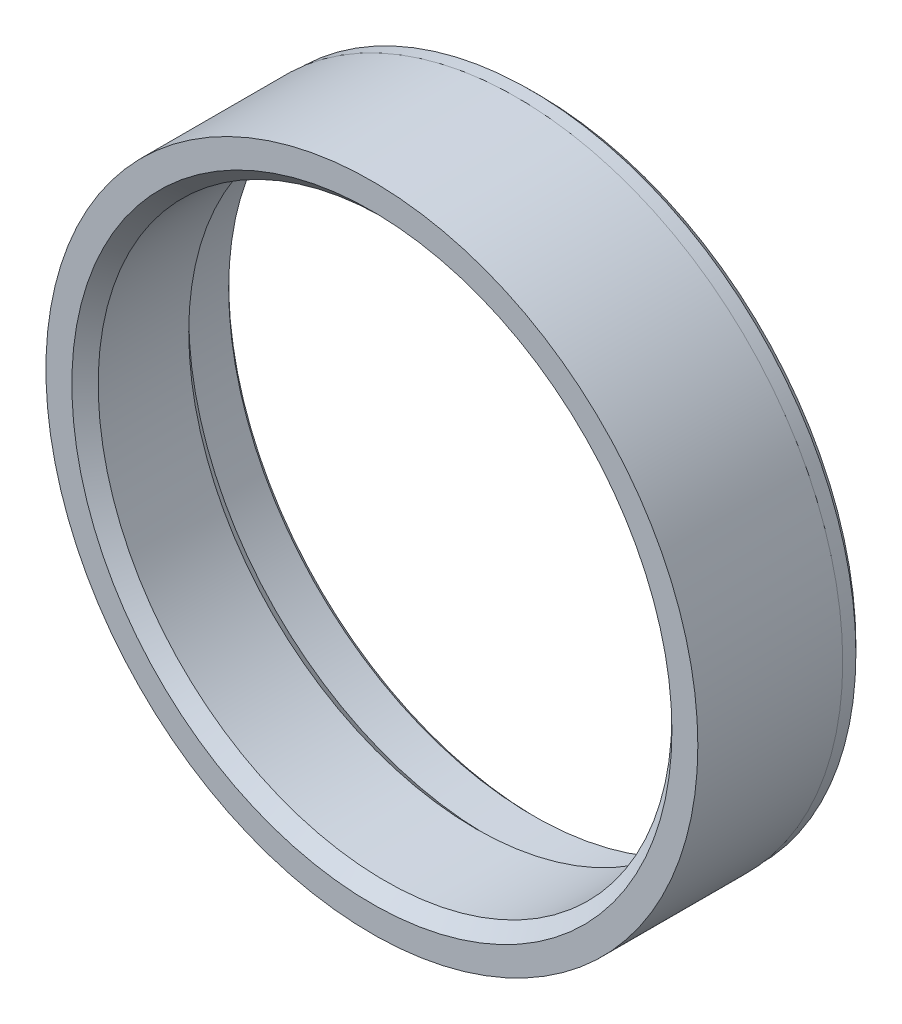
ISO-10303-21;
HEADER;
FILE_DESCRIPTION(('STEP AP214'),'2;1');
FILE_NAME('part.step','',(''),(''),'','','');
FILE_SCHEMA(('AUTOMOTIVE_DESIGN { 1 0 10303 214 1 1 1 1 }'));
ENDSEC;
DATA;
#1=APPLICATION_CONTEXT('core data for automotive mechanical design processes');
#2=APPLICATION_PROTOCOL_DEFINITION('international standard','automotive_design',2000,#1);
#3=PRODUCT_CONTEXT('',#1,'mechanical');
#4=PRODUCT('Part','Part','',(#3));
#5=PRODUCT_RELATED_PRODUCT_CATEGORY('part','',(#4));
#6=PRODUCT_DEFINITION_FORMATION('','',#4);
#7=PRODUCT_DEFINITION_CONTEXT('part definition',#1,'design');
#8=PRODUCT_DEFINITION('design','',#6,#7);
#9=PRODUCT_DEFINITION_SHAPE('','',#8);
#10=(LENGTH_UNIT() NAMED_UNIT(*) SI_UNIT(.MILLI.,.METRE.));
#11=(NAMED_UNIT(*) PLANE_ANGLE_UNIT() SI_UNIT($,.RADIAN.));
#12=(NAMED_UNIT(*) SI_UNIT($,.STERADIAN.) SOLID_ANGLE_UNIT());
#13=UNCERTAINTY_MEASURE_WITH_UNIT(LENGTH_MEASURE(1.E-05),#10,'distance_accuracy_value','');
#14=(GEOMETRIC_REPRESENTATION_CONTEXT(3) GLOBAL_UNCERTAINTY_ASSIGNED_CONTEXT((#13)) GLOBAL_UNIT_ASSIGNED_CONTEXT((#10,
#11,#12)) REPRESENTATION_CONTEXT('',''));
#15=CARTESIAN_POINT('',(0.,0.,0.));
#16=DIRECTION('',(0.,0.,1.));
#17=DIRECTION('',(1.,0.,0.));
#18=AXIS2_PLACEMENT_3D('',#15,#16,#17);
#19=CARTESIAN_POINT('',(0.,0.,-10.1));
#20=DIRECTION('',(0.,0.,1.));
#21=DIRECTION('',(1.,0.,0.));
#22=AXIS2_PLACEMENT_3D('',#19,#20,#21);
#23=CYLINDRICAL_SURFACE('',#22,19.8);
#24=CARTESIAN_POINT('',(0.,0.,0.));
#25=DIRECTION('',(0.,0.,1.));
#26=DIRECTION('',(1.,0.,0.));
#27=AXIS2_PLACEMENT_3D('',#24,#25,#26);
#28=CIRCLE('',#27,19.8);
#29=CARTESIAN_POINT('',(19.8,0.,0.));
#30=VERTEX_POINT('',#29);
#31=EDGE_CURVE('E66',#30,#30,#28,.T.);
#32=ORIENTED_EDGE('',*,*,#31,.F.);
#33=EDGE_LOOP('',(#32));
#34=FACE_BOUND('',#33,.T.);
#35=CARTESIAN_POINT('',(0.,0.,-8.8));
#36=DIRECTION('',(0.,0.,-1.));
#37=DIRECTION('',(-1.,0.,0.));
#38=AXIS2_PLACEMENT_3D('',#35,#36,#37);
#39=CIRCLE('',#38,19.8);
#40=CARTESIAN_POINT('',(-19.8,0.,-8.8));
#41=VERTEX_POINT('',#40);
#42=EDGE_CURVE('E50',#41,#41,#39,.F.);
#43=ORIENTED_EDGE('',*,*,#42,.T.);
#44=EDGE_LOOP('',(#43));
#45=FACE_BOUND('',#44,.T.);
#46=ADVANCED_FACE('F15',(#34,#45),#23,.T.);
#47=CARTESIAN_POINT('',(0.,0.,-9.6));
#48=DIRECTION('',(0.,0.,1.));
#49=DIRECTION('',(1.,0.,0.));
#50=AXIS2_PLACEMENT_3D('',#47,#48,#49);
#51=CONICAL_SURFACE('',#50,19.8,0.785398163397448);
#52=CARTESIAN_POINT('',(0.,0.,-10.1));
#53=DIRECTION('',(0.,0.,1.));
#54=DIRECTION('',(1.,0.,0.));
#55=AXIS2_PLACEMENT_3D('',#52,#53,#54);
#56=CIRCLE('',#55,19.3);
#57=CARTESIAN_POINT('',(19.3,0.,-10.1));
#58=VERTEX_POINT('',#57);
#59=EDGE_CURVE('E46',#58,#58,#56,.F.);
#60=ORIENTED_EDGE('',*,*,#59,.F.);
#61=EDGE_LOOP('',(#60));
#62=FACE_BOUND('',#61,.T.);
#63=CARTESIAN_POINT('',(0.,0.,-9.65));
#64=DIRECTION('',(0.,0.,1.));
#65=DIRECTION('',(1.,0.,0.));
#66=AXIS2_PLACEMENT_3D('',#63,#64,#65);
#67=CIRCLE('',#66,19.75);
#68=CARTESIAN_POINT('',(19.75,0.,-9.65));
#69=VERTEX_POINT('',#68);
#70=EDGE_CURVE('E55',#69,#69,#67,.F.);
#71=ORIENTED_EDGE('',*,*,#70,.T.);
#72=EDGE_LOOP('',(#71));
#73=FACE_BOUND('',#72,.T.);
#74=ADVANCED_FACE('F99',(#62,#73),#51,.T.);
#75=CARTESIAN_POINT('',(0.,0.,-10.1));
#76=DIRECTION('',(0.,0.,1.));
#77=DIRECTION('',(1.,0.,0.));
#78=AXIS2_PLACEMENT_3D('',#75,#76,#77);
#79=CYLINDRICAL_SURFACE('',#78,17.425);
#80=CARTESIAN_POINT('',(0.,0.,-0.8));
#81=DIRECTION('',(0.,0.,1.));
#82=DIRECTION('',(1.,0.,0.));
#83=AXIS2_PLACEMENT_3D('',#80,#81,#82);
#84=CIRCLE('',#83,17.425);
#85=CARTESIAN_POINT('',(17.425,0.,-0.8));
#86=VERTEX_POINT('',#85);
#87=EDGE_CURVE('E10',#86,#86,#84,.T.);
#88=ORIENTED_EDGE('',*,*,#87,.T.);
#89=EDGE_LOOP('',(#88));
#90=FACE_BOUND('',#89,.T.);
#91=CARTESIAN_POINT('',(0.,0.,-6.3));
#92=DIRECTION('',(0.,0.,-1.));
#93=DIRECTION('',(-1.,0.,0.));
#94=AXIS2_PLACEMENT_3D('',#91,#92,#93);
#95=CIRCLE('',#94,17.425);
#96=CARTESIAN_POINT('',(-17.425,0.,-6.3));
#97=VERTEX_POINT('',#96);
#98=EDGE_CURVE('E41',#97,#97,#95,.T.);
#99=ORIENTED_EDGE('',*,*,#98,.T.);
#100=EDGE_LOOP('',(#99));
#101=FACE_BOUND('',#100,.T.);
#102=ADVANCED_FACE('F105',(#90,#101),#79,.F.);
#103=CARTESIAN_POINT('',(0.,0.,-10.1));
#104=DIRECTION('',(0.,0.,1.));
#105=DIRECTION('',(1.,0.,0.));
#106=AXIS2_PLACEMENT_3D('',#103,#104,#105);
#107=PLANE('',#106);
#108=CARTESIAN_POINT('',(0.,0.,-10.1));
#109=DIRECTION('',(0.,0.,1.));
#110=DIRECTION('',(1.,0.,0.));
#111=AXIS2_PLACEMENT_3D('',#108,#109,#110);
#112=CIRCLE('',#111,18.8);
#113=CARTESIAN_POINT('',(18.8,0.,-10.1));
#114=VERTEX_POINT('',#113);
#115=EDGE_CURVE('E31',#114,#114,#112,.T.);
#116=ORIENTED_EDGE('',*,*,#115,.T.);
#117=EDGE_LOOP('',(#116));
#118=FACE_BOUND('',#117,.T.);
#119=ORIENTED_EDGE('',*,*,#59,.T.);
#120=EDGE_LOOP('',(#119));
#121=FACE_BOUND('',#120,.T.);
#122=ADVANCED_FACE('F111',(#118,#121),#107,.F.);
#123=CARTESIAN_POINT('',(0.,0.,0.));
#124=DIRECTION('',(0.,0.,1.));
#125=DIRECTION('',(1.,0.,0.));
#126=AXIS2_PLACEMENT_3D('',#123,#124,#125);
#127=PLANE('',#126);
#128=CARTESIAN_POINT('',(0.,0.,0.));
#129=DIRECTION('',(0.,0.,1.));
#130=DIRECTION('',(1.,0.,0.));
#131=AXIS2_PLACEMENT_3D('',#128,#129,#130);
#132=CIRCLE('',#131,18.225);
#133=CARTESIAN_POINT('',(18.225,0.,0.));
#134=VERTEX_POINT('',#133);
#135=EDGE_CURVE('E23',#134,#134,#132,.F.);
#136=ORIENTED_EDGE('',*,*,#135,.T.);
#137=EDGE_LOOP('',(#136));
#138=FACE_BOUND('',#137,.T.);
#139=ORIENTED_EDGE('',*,*,#31,.T.);
#140=EDGE_LOOP('',(#139));
#141=FACE_BOUND('',#140,.T.);
#142=ADVANCED_FACE('F118',(#138,#141),#127,.T.);
#143=CARTESIAN_POINT('',(0.,0.,-7.1));
#144=DIRECTION('',(0.,0.,-1.));
#145=DIRECTION('',(-1.,0.,0.));
#146=AXIS2_PLACEMENT_3D('',#143,#144,#145);
#147=CYLINDRICAL_SURFACE('',#146,18.5);
#148=CARTESIAN_POINT('',(0.,0.,-9.8));
#149=DIRECTION('',(0.,0.,1.));
#150=DIRECTION('',(1.,0.,0.));
#151=AXIS2_PLACEMENT_3D('',#148,#149,#150);
#152=CIRCLE('',#151,18.5);
#153=CARTESIAN_POINT('',(18.5,0.,-9.8));
#154=VERTEX_POINT('',#153);
#155=EDGE_CURVE('E38',#154,#154,#152,.F.);
#156=ORIENTED_EDGE('',*,*,#155,.T.);
#157=EDGE_LOOP('',(#156));
#158=FACE_BOUND('',#157,.T.);
#159=CARTESIAN_POINT('',(0.,0.,-7.1));
#160=DIRECTION('',(0.,0.,-1.));
#161=DIRECTION('',(1.,0.,0.));
#162=AXIS2_PLACEMENT_3D('',#159,#160,#161);
#163=CIRCLE('',#162,18.5);
#164=CARTESIAN_POINT('',(18.5,0.,-7.1));
#165=VERTEX_POINT('',#164);
#166=EDGE_CURVE('E54',#165,#165,#163,.F.);
#167=ORIENTED_EDGE('',*,*,#166,.T.);
#168=EDGE_LOOP('',(#167));
#169=FACE_BOUND('',#168,.T.);
#170=ADVANCED_FACE('F120',(#158,#169),#147,.F.);
#171=CARTESIAN_POINT('',(0.,0.,-7.1));
#172=DIRECTION('',(0.,0.,-1.));
#173=DIRECTION('',(-1.,0.,0.));
#174=AXIS2_PLACEMENT_3D('',#171,#172,#173);
#175=PLANE('',#174);
#176=CARTESIAN_POINT('',(0.,0.,-7.1));
#177=DIRECTION('',(0.,0.,-1.));
#178=DIRECTION('',(-1.,0.,0.));
#179=AXIS2_PLACEMENT_3D('',#176,#177,#178);
#180=CIRCLE('',#179,18.225);
#181=CARTESIAN_POINT('',(-18.225,0.,-7.1));
#182=VERTEX_POINT('',#181);
#183=EDGE_CURVE('E45',#182,#182,#180,.F.);
#184=ORIENTED_EDGE('',*,*,#183,.T.);
#185=EDGE_LOOP('',(#184));
#186=FACE_BOUND('',#185,.T.);
#187=ORIENTED_EDGE('',*,*,#166,.F.);
#188=EDGE_LOOP('',(#187));
#189=FACE_BOUND('',#188,.T.);
#190=ADVANCED_FACE('F116',(#186,#189),#175,.T.);
#191=CARTESIAN_POINT('',(0.,0.,-6.3));
#192=DIRECTION('',(0.,0.,-1.));
#193=DIRECTION('',(-1.,0.,0.));
#194=AXIS2_PLACEMENT_3D('',#191,#192,#193);
#195=CONICAL_SURFACE('',#194,17.425,0.785398163397448);
#196=ORIENTED_EDGE('',*,*,#183,.F.);
#197=EDGE_LOOP('',(#196));
#198=FACE_BOUND('',#197,.T.);
#199=ORIENTED_EDGE('',*,*,#98,.F.);
#200=EDGE_LOOP('',(#199));
#201=FACE_BOUND('',#200,.T.);
#202=ADVANCED_FACE('F93',(#198,#201),#195,.F.);
#203=CARTESIAN_POINT('',(0.,0.,-9.8));
#204=DIRECTION('',(0.,0.,-1.));
#205=DIRECTION('',(-1.,0.,0.));
#206=AXIS2_PLACEMENT_3D('',#203,#204,#205);
#207=CONICAL_SURFACE('',#206,18.5,0.785398163397451);
#208=ORIENTED_EDGE('',*,*,#115,.F.);
#209=EDGE_LOOP('',(#208));
#210=FACE_BOUND('',#209,.T.);
#211=ORIENTED_EDGE('',*,*,#155,.F.);
#212=EDGE_LOOP('',(#211));
#213=FACE_BOUND('',#212,.T.);
#214=ADVANCED_FACE('F83',(#210,#213),#207,.F.);
#215=CARTESIAN_POINT('',(0.,0.,-8.8));
#216=DIRECTION('',(0.,0.,-1.));
#217=DIRECTION('',(-1.,0.,0.));
#218=AXIS2_PLACEMENT_3D('',#215,#216,#217);
#219=CYLINDRICAL_SURFACE('',#218,19.75);
#220=ORIENTED_EDGE('',*,*,#70,.F.);
#221=EDGE_LOOP('',(#220));
#222=FACE_BOUND('',#221,.T.);
#223=CARTESIAN_POINT('',(0.,0.,-8.8));
#224=DIRECTION('',(0.,0.,-1.));
#225=DIRECTION('',(-1.,0.,0.));
#226=AXIS2_PLACEMENT_3D('',#223,#224,#225);
#227=CIRCLE('',#226,19.75);
#228=CARTESIAN_POINT('',(-19.75,0.,-8.8));
#229=VERTEX_POINT('',#228);
#230=EDGE_CURVE('E58',#229,#229,#227,.F.);
#231=ORIENTED_EDGE('',*,*,#230,.F.);
#232=EDGE_LOOP('',(#231));
#233=FACE_BOUND('',#232,.T.);
#234=ADVANCED_FACE('F81',(#222,#233),#219,.T.);
#235=CARTESIAN_POINT('',(0.,0.,-8.8));
#236=DIRECTION('',(0.,0.,-1.));
#237=DIRECTION('',(-1.,0.,0.));
#238=AXIS2_PLACEMENT_3D('',#235,#236,#237);
#239=PLANE('',#238);
#240=ORIENTED_EDGE('',*,*,#42,.F.);
#241=EDGE_LOOP('',(#240));
#242=FACE_BOUND('',#241,.T.);
#243=ORIENTED_EDGE('',*,*,#230,.T.);
#244=EDGE_LOOP('',(#243));
#245=FACE_BOUND('',#244,.T.);
#246=ADVANCED_FACE('F79',(#242,#245),#239,.T.);
#247=CARTESIAN_POINT('',(0.,0.,0.));
#248=DIRECTION('',(0.,0.,1.));
#249=DIRECTION('',(1.,0.,0.));
#250=AXIS2_PLACEMENT_3D('',#247,#248,#249);
#251=CONICAL_SURFACE('',#250,18.225,0.785398163397448);
#252=ORIENTED_EDGE('',*,*,#87,.F.);
#253=EDGE_LOOP('',(#252));
#254=FACE_BOUND('',#253,.T.);
#255=ORIENTED_EDGE('',*,*,#135,.F.);
#256=EDGE_LOOP('',(#255));
#257=FACE_BOUND('',#256,.T.);
#258=ADVANCED_FACE('F17',(#254,#257),#251,.F.);
#259=CLOSED_SHELL('',(#46,#74,#102,#122,#142,#170,#190,#202,#214,#234,#246,#258));
#260=MANIFOLD_SOLID_BREP('B1',#259);
#261=ADVANCED_BREP_SHAPE_REPRESENTATION('',(#18,#260),#14);
#262=SHAPE_DEFINITION_REPRESENTATION(#9,#261);
ENDSEC;
END-ISO-10303-21;
